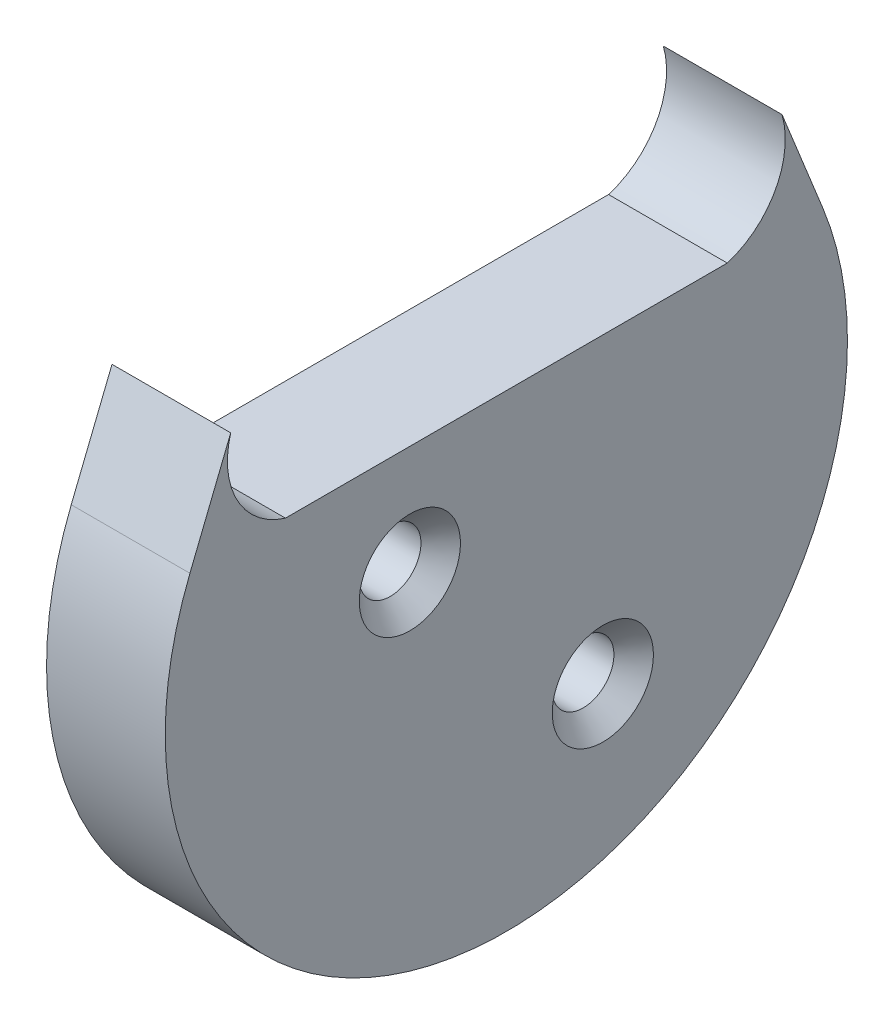
ISO-10303-21;
HEADER;
FILE_DESCRIPTION(('STEP AP214'),'2;1');
FILE_NAME('part.step','',(''),(''),'','','');
FILE_SCHEMA(('AUTOMOTIVE_DESIGN { 1 0 10303 214 1 1 1 1 }'));
ENDSEC;
DATA;
#1=APPLICATION_CONTEXT('core data for automotive mechanical design processes');
#2=APPLICATION_PROTOCOL_DEFINITION('international standard','automotive_design',2000,#1);
#3=PRODUCT_CONTEXT('',#1,'mechanical');
#4=PRODUCT('Part','Part','',(#3));
#5=PRODUCT_RELATED_PRODUCT_CATEGORY('part','',(#4));
#6=PRODUCT_DEFINITION_FORMATION('','',#4);
#7=PRODUCT_DEFINITION_CONTEXT('part definition',#1,'design');
#8=PRODUCT_DEFINITION('design','',#6,#7);
#9=PRODUCT_DEFINITION_SHAPE('','',#8);
#10=(LENGTH_UNIT() NAMED_UNIT(*) SI_UNIT(.MILLI.,.METRE.));
#11=(NAMED_UNIT(*) PLANE_ANGLE_UNIT() SI_UNIT($,.RADIAN.));
#12=(NAMED_UNIT(*) SI_UNIT($,.STERADIAN.) SOLID_ANGLE_UNIT());
#13=UNCERTAINTY_MEASURE_WITH_UNIT(LENGTH_MEASURE(1.E-05),#10,'distance_accuracy_value','');
#14=(GEOMETRIC_REPRESENTATION_CONTEXT(3) GLOBAL_UNCERTAINTY_ASSIGNED_CONTEXT((#13)) GLOBAL_UNIT_ASSIGNED_CONTEXT((#10,
#11,#12)) REPRESENTATION_CONTEXT('',''));
#15=CARTESIAN_POINT('',(0.,0.,0.));
#16=DIRECTION('',(0.,0.,1.));
#17=DIRECTION('',(1.,0.,0.));
#18=AXIS2_PLACEMENT_3D('',#15,#16,#17);
#19=CARTESIAN_POINT('',(2.175,7.53839392418819,7.22177589768703));
#20=DIRECTION('',(-1.,0.,0.));
#21=DIRECTION('',(0.,0.,1.));
#22=AXIS2_PLACEMENT_3D('',#19,#20,#21);
#23=CYLINDRICAL_SURFACE('',#22,3.);
#24=CARTESIAN_POINT('',(-2.175,7.53839392418819,7.22177589768703));
#25=DIRECTION('',(1.,0.,0.));
#26=DIRECTION('',(0.,0.,-1.));
#27=AXIS2_PLACEMENT_3D('',#24,#25,#26);
#28=CIRCLE('',#27,3.);
#29=CARTESIAN_POINT('',(-2.175,8.37900511052663,10.1015975646315));
#30=VERTEX_POINT('',#29);
#31=CARTESIAN_POINT('',(-2.175,4.66844511052663,8.0955));
#32=VERTEX_POINT('',#31);
#33=EDGE_CURVE('E152',#30,#32,#28,.T.);
#34=ORIENTED_EDGE('',*,*,#33,.F.);
#35=DIRECTION('',(-1.,0.,0.));
#36=VECTOR('',#35,1.);
#37=CARTESIAN_POINT('',(2.175,8.37900511052663,10.1015975646315));
#38=LINE('',#37,#36);
#39=CARTESIAN_POINT('',(2.175,8.37900511052663,10.1015975646315));
#40=VERTEX_POINT('',#39);
#41=EDGE_CURVE('E12',#40,#30,#38,.T.);
#42=ORIENTED_EDGE('',*,*,#41,.F.);
#43=CARTESIAN_POINT('',(2.175,7.53839392418819,7.22177589768703));
#44=DIRECTION('',(1.,0.,0.));
#45=DIRECTION('',(0.,0.,-1.));
#46=AXIS2_PLACEMENT_3D('',#43,#44,#45);
#47=CIRCLE('',#46,3.);
#48=CARTESIAN_POINT('',(2.175,4.66844511052663,8.0955));
#49=VERTEX_POINT('',#48);
#50=EDGE_CURVE('E164',#40,#49,#47,.T.);
#51=ORIENTED_EDGE('',*,*,#50,.T.);
#52=DIRECTION('',(-1.,0.,0.));
#53=VECTOR('',#52,1.);
#54=CARTESIAN_POINT('',(2.175,4.66844511052663,8.0955));
#55=LINE('',#54,#53);
#56=EDGE_CURVE('E85',#49,#32,#55,.T.);
#57=ORIENTED_EDGE('',*,*,#56,.T.);
#58=EDGE_LOOP('',(#34,#42,#51,#57));
#59=FACE_BOUND('',#58,.T.);
#60=ADVANCED_FACE('F66',(#59),#23,.F.);
#61=CARTESIAN_POINT('',(2.175,4.66844511052663,11.5955));
#62=DIRECTION('',(0.,0.373475608842131,0.92764));
#63=DIRECTION('',(0.,-0.92764,0.373475608842131));
#64=AXIS2_PLACEMENT_3D('',#61,#62,#63);
#65=PLANE('',#64);
#66=DIRECTION('',(0.,0.92764,-0.373475608842131));
#67=VECTOR('',#66,1.);
#68=CARTESIAN_POINT('',(-2.175,4.66844511052663,11.5955));
#69=LINE('',#68,#67);
#70=CARTESIAN_POINT('',(-2.175,4.66844511052663,11.5955));
#71=VERTEX_POINT('',#70);
#72=EDGE_CURVE('E168',#71,#30,#69,.T.);
#73=ORIENTED_EDGE('',*,*,#72,.F.);
#74=DIRECTION('',(-1.,0.,0.));
#75=VECTOR('',#74,1.);
#76=CARTESIAN_POINT('',(2.175,4.66844511052663,11.5955));
#77=LINE('',#76,#75);
#78=CARTESIAN_POINT('',(2.175,4.66844511052663,11.5955));
#79=VERTEX_POINT('',#78);
#80=EDGE_CURVE('E76',#79,#71,#77,.T.);
#81=ORIENTED_EDGE('',*,*,#80,.F.);
#82=DIRECTION('',(0.,0.92764,-0.373475608842131));
#83=VECTOR('',#82,1.);
#84=CARTESIAN_POINT('',(2.175,4.66844511052663,11.5955));
#85=LINE('',#84,#83);
#86=EDGE_CURVE('E167',#79,#40,#85,.T.);
#87=ORIENTED_EDGE('',*,*,#86,.T.);
#88=ORIENTED_EDGE('',*,*,#41,.T.);
#89=EDGE_LOOP('',(#73,#81,#87,#88));
#90=FACE_BOUND('',#89,.T.);
#91=ADVANCED_FACE('F186',(#90),#65,.T.);
#92=CARTESIAN_POINT('',(2.175,0.,0.));
#93=DIRECTION('',(1.,0.,0.));
#94=DIRECTION('',(0.,0.,-1.));
#95=AXIS2_PLACEMENT_3D('',#92,#93,#94);
#96=PLANE('',#95);
#97=CARTESIAN_POINT('',(2.175,0.668445110526633,3.53553390593274));
#98=DIRECTION('',(1.,0.,0.));
#99=DIRECTION('',(0.,0.,-1.));
#100=AXIS2_PLACEMENT_3D('',#97,#98,#99);
#101=CIRCLE('',#100,1.8542);
#102=CARTESIAN_POINT('',(2.175,0.668445110526633,1.68133390593274));
#103=VERTEX_POINT('',#102);
#104=EDGE_CURVE('E238',#103,#103,#101,.T.);
#105=ORIENTED_EDGE('',*,*,#104,.F.);
#106=EDGE_LOOP('',(#105));
#107=FACE_BOUND('',#106,.T.);
#108=CARTESIAN_POINT('',(2.175,-6.40262270133885,-3.53553390593275));
#109=DIRECTION('',(1.,0.,0.));
#110=DIRECTION('',(0.,0.,-1.));
#111=AXIS2_PLACEMENT_3D('',#108,#109,#110);
#112=CIRCLE('',#111,1.8542);
#113=CARTESIAN_POINT('',(2.175,-6.40262270133885,-5.38973390593275));
#114=VERTEX_POINT('',#113);
#115=EDGE_CURVE('E160',#114,#114,#112,.T.);
#116=ORIENTED_EDGE('',*,*,#115,.F.);
#117=EDGE_LOOP('',(#116));
#118=FACE_BOUND('',#117,.T.);
#119=ORIENTED_EDGE('',*,*,#50,.F.);
#120=ORIENTED_EDGE('',*,*,#86,.F.);
#121=CARTESIAN_POINT('',(2.175,0.,0.));
#122=DIRECTION('',(1.,0.,0.));
#123=DIRECTION('',(0.,0.,-1.));
#124=AXIS2_PLACEMENT_3D('',#121,#122,#123);
#125=CIRCLE('',#124,12.5);
#126=CARTESIAN_POINT('',(2.175,4.66844511052663,-11.5955));
#127=VERTEX_POINT('',#126);
#128=EDGE_CURVE('E142',#79,#127,#125,.T.);
#129=ORIENTED_EDGE('',*,*,#128,.T.);
#130=DIRECTION('',(0.,0.92764,0.373475608842131));
#131=VECTOR('',#130,1.);
#132=CARTESIAN_POINT('',(2.175,4.66844511052664,-11.5955));
#133=LINE('',#132,#131);
#134=CARTESIAN_POINT('',(2.175,8.37900511052663,-10.1015975646315));
#135=VERTEX_POINT('',#134);
#136=EDGE_CURVE('E126',#127,#135,#133,.T.);
#137=ORIENTED_EDGE('',*,*,#136,.T.);
#138=CARTESIAN_POINT('',(2.175,7.5383939241882,-7.22177589768703));
#139=DIRECTION('',(1.,0.,0.));
#140=DIRECTION('',(0.,0.,-1.));
#141=AXIS2_PLACEMENT_3D('',#138,#139,#140);
#142=CIRCLE('',#141,3.);
#143=CARTESIAN_POINT('',(2.175,4.66844511052663,-8.09549999999998));
#144=VERTEX_POINT('',#143);
#145=EDGE_CURVE('E131',#135,#144,#142,.F.);
#146=ORIENTED_EDGE('',*,*,#145,.T.);
#147=DIRECTION('',(0.,0.,-1.));
#148=VECTOR('',#147,1.);
#149=CARTESIAN_POINT('',(2.175,4.66844511052663,11.5955));
#150=LINE('',#149,#148);
#151=EDGE_CURVE('E137',#49,#144,#150,.T.);
#152=ORIENTED_EDGE('',*,*,#151,.F.);
#153=EDGE_LOOP('',(#119,#120,#129,#137,#146,#152));
#154=FACE_BOUND('',#153,.T.);
#155=ADVANCED_FACE('F177',(#107,#118,#154),#96,.T.);
#156=CARTESIAN_POINT('',(-2.175,0.,0.));
#157=DIRECTION('',(1.,0.,0.));
#158=DIRECTION('',(0.,0.,-1.));
#159=AXIS2_PLACEMENT_3D('',#156,#157,#158);
#160=PLANE('',#159);
#161=CARTESIAN_POINT('',(-2.175,0.668445110526633,3.53553390593274));
#162=DIRECTION('',(1.,0.,0.));
#163=DIRECTION('',(0.,0.,-1.));
#164=AXIS2_PLACEMENT_3D('',#161,#162,#163);
#165=CIRCLE('',#164,1.1303);
#166=CARTESIAN_POINT('',(-2.175,0.668445110526633,2.40523390593274));
#167=VERTEX_POINT('',#166);
#168=EDGE_CURVE('E240',#167,#167,#165,.T.);
#169=ORIENTED_EDGE('',*,*,#168,.T.);
#170=EDGE_LOOP('',(#169));
#171=FACE_BOUND('',#170,.T.);
#172=CARTESIAN_POINT('',(-2.175,-6.40262270133885,-3.53553390593275));
#173=DIRECTION('',(1.,0.,0.));
#174=DIRECTION('',(0.,0.,-1.));
#175=AXIS2_PLACEMENT_3D('',#172,#173,#174);
#176=CIRCLE('',#175,1.1303);
#177=CARTESIAN_POINT('',(-2.175,-6.40262270133885,-4.66583390593275));
#178=VERTEX_POINT('',#177);
#179=EDGE_CURVE('E153',#178,#178,#176,.T.);
#180=ORIENTED_EDGE('',*,*,#179,.T.);
#181=EDGE_LOOP('',(#180));
#182=FACE_BOUND('',#181,.T.);
#183=ORIENTED_EDGE('',*,*,#33,.T.);
#184=DIRECTION('',(0.,0.,-1.));
#185=VECTOR('',#184,1.);
#186=CARTESIAN_POINT('',(-2.175,4.66844511052663,11.5955));
#187=LINE('',#186,#185);
#188=CARTESIAN_POINT('',(-2.175,4.66844511052663,-8.09549999999998));
#189=VERTEX_POINT('',#188);
#190=EDGE_CURVE('E113',#32,#189,#187,.T.);
#191=ORIENTED_EDGE('',*,*,#190,.T.);
#192=CARTESIAN_POINT('',(-2.175,7.5383939241882,-7.22177589768703));
#193=DIRECTION('',(1.,0.,0.));
#194=DIRECTION('',(0.,0.,-1.));
#195=AXIS2_PLACEMENT_3D('',#192,#193,#194);
#196=CIRCLE('',#195,3.);
#197=CARTESIAN_POINT('',(-2.175,8.37900511052663,-10.1015975646315));
#198=VERTEX_POINT('',#197);
#199=EDGE_CURVE('E140',#198,#189,#196,.F.);
#200=ORIENTED_EDGE('',*,*,#199,.F.);
#201=DIRECTION('',(0.,0.92764,0.373475608842131));
#202=VECTOR('',#201,1.);
#203=CARTESIAN_POINT('',(-2.175,4.66844511052664,-11.5955));
#204=LINE('',#203,#202);
#205=CARTESIAN_POINT('',(-2.175,4.66844511052663,-11.5955));
#206=VERTEX_POINT('',#205);
#207=EDGE_CURVE('E124',#206,#198,#204,.T.);
#208=ORIENTED_EDGE('',*,*,#207,.F.);
#209=CARTESIAN_POINT('',(-2.175,0.,0.));
#210=DIRECTION('',(1.,0.,0.));
#211=DIRECTION('',(0.,0.,-1.));
#212=AXIS2_PLACEMENT_3D('',#209,#210,#211);
#213=CIRCLE('',#212,12.5);
#214=EDGE_CURVE('E70',#71,#206,#213,.T.);
#215=ORIENTED_EDGE('',*,*,#214,.F.);
#216=ORIENTED_EDGE('',*,*,#72,.T.);
#217=EDGE_LOOP('',(#183,#191,#200,#208,#215,#216));
#218=FACE_BOUND('',#217,.T.);
#219=ADVANCED_FACE('F138',(#171,#182,#218),#160,.F.);
#220=CARTESIAN_POINT('',(2.175,7.5383939241882,-7.22177589768703));
#221=DIRECTION('',(-1.,0.,0.));
#222=DIRECTION('',(0.,0.,1.));
#223=AXIS2_PLACEMENT_3D('',#220,#221,#222);
#224=CYLINDRICAL_SURFACE('',#223,3.);
#225=ORIENTED_EDGE('',*,*,#199,.T.);
#226=DIRECTION('',(-1.,0.,0.));
#227=VECTOR('',#226,1.);
#228=CARTESIAN_POINT('',(2.175,4.66844511052663,-8.09549999999998));
#229=LINE('',#228,#227);
#230=EDGE_CURVE('E130',#144,#189,#229,.T.);
#231=ORIENTED_EDGE('',*,*,#230,.F.);
#232=ORIENTED_EDGE('',*,*,#145,.F.);
#233=DIRECTION('',(-1.,0.,0.));
#234=VECTOR('',#233,1.);
#235=CARTESIAN_POINT('',(2.175,8.37900511052663,-10.1015975646315));
#236=LINE('',#235,#234);
#237=EDGE_CURVE('E150',#135,#198,#236,.T.);
#238=ORIENTED_EDGE('',*,*,#237,.T.);
#239=EDGE_LOOP('',(#225,#231,#232,#238));
#240=FACE_BOUND('',#239,.T.);
#241=ADVANCED_FACE('F180',(#240),#224,.F.);
#242=CARTESIAN_POINT('',(2.175,4.66844511052664,-11.5955));
#243=DIRECTION('',(0.,-0.373475608842131,0.92764));
#244=DIRECTION('',(0.,-0.92764,-0.373475608842131));
#245=AXIS2_PLACEMENT_3D('',#242,#243,#244);
#246=PLANE('',#245);
#247=ORIENTED_EDGE('',*,*,#207,.T.);
#248=ORIENTED_EDGE('',*,*,#237,.F.);
#249=ORIENTED_EDGE('',*,*,#136,.F.);
#250=DIRECTION('',(-1.,0.,0.));
#251=VECTOR('',#250,1.);
#252=CARTESIAN_POINT('',(2.175,4.66844511052663,-11.5955));
#253=LINE('',#252,#251);
#254=EDGE_CURVE('E119',#127,#206,#253,.T.);
#255=ORIENTED_EDGE('',*,*,#254,.T.);
#256=EDGE_LOOP('',(#247,#248,#249,#255));
#257=FACE_BOUND('',#256,.T.);
#258=ADVANCED_FACE('F121',(#257),#246,.F.);
#259=CARTESIAN_POINT('',(2.175,0.,0.));
#260=DIRECTION('',(-1.,0.,0.));
#261=DIRECTION('',(0.,0.,1.));
#262=AXIS2_PLACEMENT_3D('',#259,#260,#261);
#263=CYLINDRICAL_SURFACE('',#262,12.5);
#264=ORIENTED_EDGE('',*,*,#214,.T.);
#265=ORIENTED_EDGE('',*,*,#254,.F.);
#266=ORIENTED_EDGE('',*,*,#128,.F.);
#267=ORIENTED_EDGE('',*,*,#80,.T.);
#268=EDGE_LOOP('',(#264,#265,#266,#267));
#269=FACE_BOUND('',#268,.T.);
#270=ADVANCED_FACE('F134',(#269),#263,.T.);
#271=CARTESIAN_POINT('',(2.175,4.66844511052663,11.5955));
#272=DIRECTION('',(0.,1.,0.));
#273=DIRECTION('',(0.,0.,1.));
#274=AXIS2_PLACEMENT_3D('',#271,#272,#273);
#275=PLANE('',#274);
#276=ORIENTED_EDGE('',*,*,#56,.F.);
#277=ORIENTED_EDGE('',*,*,#151,.T.);
#278=ORIENTED_EDGE('',*,*,#230,.T.);
#279=ORIENTED_EDGE('',*,*,#190,.F.);
#280=EDGE_LOOP('',(#276,#277,#278,#279));
#281=FACE_BOUND('',#280,.T.);
#282=ADVANCED_FACE('F68',(#281),#275,.T.);
#283=CARTESIAN_POINT('',(2.175,-6.40262270133885,-3.53553390593275));
#284=DIRECTION('',(1.,0.,0.));
#285=DIRECTION('',(0.,0.,-1.));
#286=AXIS2_PLACEMENT_3D('',#283,#284,#285);
#287=CYLINDRICAL_SURFACE('',#286,1.1303);
#288=ORIENTED_EDGE('',*,*,#179,.F.);
#289=EDGE_LOOP('',(#288));
#290=FACE_BOUND('',#289,.T.);
#291=CARTESIAN_POINT('',(1.4511,-6.40262270133885,-3.53553390593275));
#292=DIRECTION('',(1.,0.,0.));
#293=DIRECTION('',(0.,0.,-1.));
#294=AXIS2_PLACEMENT_3D('',#291,#292,#293);
#295=CIRCLE('',#294,1.1303);
#296=CARTESIAN_POINT('',(1.4511,-6.40262270133885,-4.66583390593275));
#297=VERTEX_POINT('',#296);
#298=EDGE_CURVE('E155',#297,#297,#295,.T.);
#299=ORIENTED_EDGE('',*,*,#298,.T.);
#300=EDGE_LOOP('',(#299));
#301=FACE_BOUND('',#300,.T.);
#302=ADVANCED_FACE('F198',(#290,#301),#287,.F.);
#303=CARTESIAN_POINT('',(2.175,-6.40262270133885,-3.53553390593275));
#304=DIRECTION('',(1.,0.,0.));
#305=DIRECTION('',(0.,0.,-1.));
#306=AXIS2_PLACEMENT_3D('',#303,#304,#305);
#307=CONICAL_SURFACE('',#306,1.8542,0.785398163397448);
#308=ORIENTED_EDGE('',*,*,#298,.F.);
#309=EDGE_LOOP('',(#308));
#310=FACE_BOUND('',#309,.T.);
#311=ORIENTED_EDGE('',*,*,#115,.T.);
#312=EDGE_LOOP('',(#311));
#313=FACE_BOUND('',#312,.T.);
#314=ADVANCED_FACE('F203',(#310,#313),#307,.F.);
#315=CARTESIAN_POINT('',(2.175,0.668445110526633,3.53553390593274));
#316=DIRECTION('',(1.,0.,0.));
#317=DIRECTION('',(0.,0.,-1.));
#318=AXIS2_PLACEMENT_3D('',#315,#316,#317);
#319=CYLINDRICAL_SURFACE('',#318,1.1303);
#320=ORIENTED_EDGE('',*,*,#168,.F.);
#321=EDGE_LOOP('',(#320));
#322=FACE_BOUND('',#321,.T.);
#323=CARTESIAN_POINT('',(1.4511,0.668445110526633,3.53553390593274));
#324=DIRECTION('',(1.,0.,0.));
#325=DIRECTION('',(0.,0.,-1.));
#326=AXIS2_PLACEMENT_3D('',#323,#324,#325);
#327=CIRCLE('',#326,1.1303);
#328=CARTESIAN_POINT('',(1.4511,0.668445110526633,2.40523390593274));
#329=VERTEX_POINT('',#328);
#330=EDGE_CURVE('E235',#329,#329,#327,.T.);
#331=ORIENTED_EDGE('',*,*,#330,.T.);
#332=EDGE_LOOP('',(#331));
#333=FACE_BOUND('',#332,.T.);
#334=ADVANCED_FACE('F222',(#322,#333),#319,.F.);
#335=CARTESIAN_POINT('',(2.175,0.668445110526633,3.53553390593274));
#336=DIRECTION('',(1.,0.,0.));
#337=DIRECTION('',(0.,0.,-1.));
#338=AXIS2_PLACEMENT_3D('',#335,#336,#337);
#339=CONICAL_SURFACE('',#338,1.8542,0.785398163397448);
#340=ORIENTED_EDGE('',*,*,#330,.F.);
#341=EDGE_LOOP('',(#340));
#342=FACE_BOUND('',#341,.T.);
#343=ORIENTED_EDGE('',*,*,#104,.T.);
#344=EDGE_LOOP('',(#343));
#345=FACE_BOUND('',#344,.T.);
#346=ADVANCED_FACE('F226',(#342,#345),#339,.F.);
#347=CLOSED_SHELL('',(#60,#91,#155,#219,#241,#258,#270,#282,#302,#314,#334,#346));
#348=MANIFOLD_SOLID_BREP('B2',#347);
#349=ADVANCED_BREP_SHAPE_REPRESENTATION('',(#18,#348),#14);
#350=SHAPE_DEFINITION_REPRESENTATION(#9,#349);
ENDSEC;
END-ISO-10303-21;
